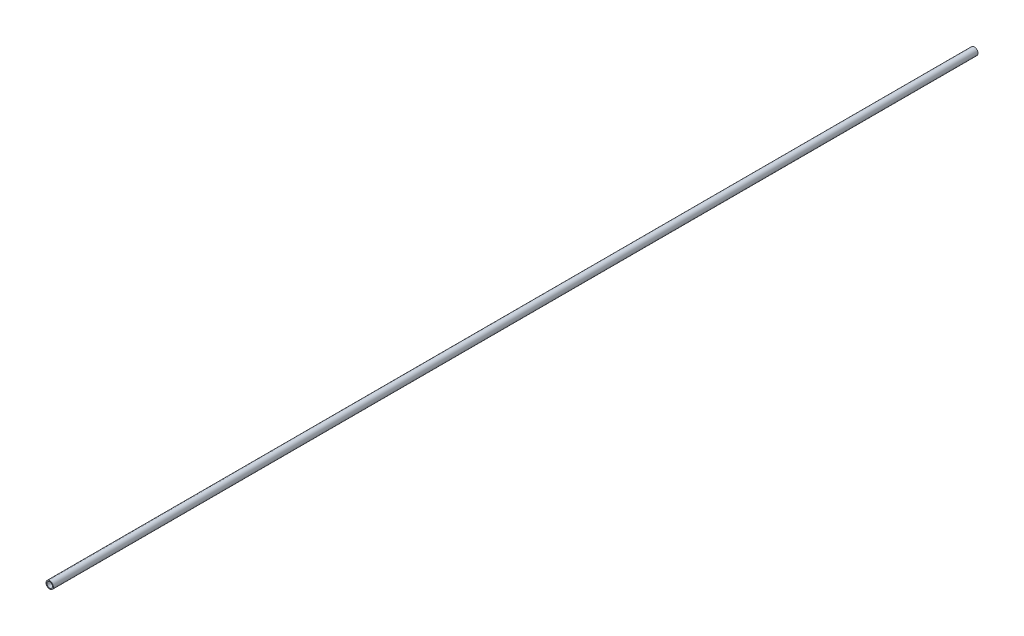
ISO-10303-21;
HEADER;
FILE_DESCRIPTION(('STEP AP214'),'2;1');
FILE_NAME('part.step','',(''),(''),'','','');
FILE_SCHEMA(('AUTOMOTIVE_DESIGN { 1 0 10303 214 1 1 1 1 }'));
ENDSEC;
DATA;
#1=APPLICATION_CONTEXT('core data for automotive mechanical design processes');
#2=APPLICATION_PROTOCOL_DEFINITION('international standard','automotive_design',2000,#1);
#3=PRODUCT_CONTEXT('',#1,'mechanical');
#4=PRODUCT('Part','Part','',(#3));
#5=PRODUCT_RELATED_PRODUCT_CATEGORY('part','',(#4));
#6=PRODUCT_DEFINITION_FORMATION('','',#4);
#7=PRODUCT_DEFINITION_CONTEXT('part definition',#1,'design');
#8=PRODUCT_DEFINITION('design','',#6,#7);
#9=PRODUCT_DEFINITION_SHAPE('','',#8);
#10=(LENGTH_UNIT() NAMED_UNIT(*) SI_UNIT(.MILLI.,.METRE.));
#11=(NAMED_UNIT(*) PLANE_ANGLE_UNIT() SI_UNIT($,.RADIAN.));
#12=(NAMED_UNIT(*) SI_UNIT($,.STERADIAN.) SOLID_ANGLE_UNIT());
#13=UNCERTAINTY_MEASURE_WITH_UNIT(LENGTH_MEASURE(1.E-05),#10,'distance_accuracy_value','');
#14=(GEOMETRIC_REPRESENTATION_CONTEXT(3) GLOBAL_UNCERTAINTY_ASSIGNED_CONTEXT((#13)) GLOBAL_UNIT_ASSIGNED_CONTEXT((#10,
#11,#12)) REPRESENTATION_CONTEXT('',''));
#15=CARTESIAN_POINT('',(0.,0.,0.));
#16=DIRECTION('',(0.,0.,1.));
#17=DIRECTION('',(1.,0.,0.));
#18=AXIS2_PLACEMENT_3D('',#15,#16,#17);
#19=CARTESIAN_POINT('',(0.,0.,1000.));
#20=DIRECTION('',(0.,0.,1.));
#21=DIRECTION('',(1.,0.,0.));
#22=AXIS2_PLACEMENT_3D('',#19,#20,#21);
#23=PLANE('',#22);
#24=CARTESIAN_POINT('',(0.,0.,1000.));
#25=DIRECTION('',(0.,0.,1.));
#26=DIRECTION('',(1.,0.,0.));
#27=AXIS2_PLACEMENT_3D('',#24,#25,#26);
#28=CIRCLE('',#27,4.);
#29=CARTESIAN_POINT('',(4.,0.,1000.));
#30=VERTEX_POINT('',#29);
#31=EDGE_CURVE('E10',#30,#30,#28,.T.);
#32=ORIENTED_EDGE('',*,*,#31,.T.);
#33=EDGE_LOOP('',(#32));
#34=FACE_BOUND('',#33,.T.);
#35=CARTESIAN_POINT('',(0.,0.,1000.));
#36=DIRECTION('',(0.,0.,1.));
#37=DIRECTION('',(1.,0.,0.));
#38=AXIS2_PLACEMENT_3D('',#35,#36,#37);
#39=CIRCLE('',#38,3.);
#40=CARTESIAN_POINT('',(3.,0.,1000.));
#41=VERTEX_POINT('',#40);
#42=EDGE_CURVE('E45',#41,#41,#39,.T.);
#43=ORIENTED_EDGE('',*,*,#42,.F.);
#44=EDGE_LOOP('',(#43));
#45=FACE_BOUND('',#44,.T.);
#46=ADVANCED_FACE('F34',(#34,#45),#23,.T.);
#47=CARTESIAN_POINT('',(0.,0.,0.));
#48=DIRECTION('',(0.,0.,1.));
#49=DIRECTION('',(1.,0.,0.));
#50=AXIS2_PLACEMENT_3D('',#47,#48,#49);
#51=PLANE('',#50);
#52=CARTESIAN_POINT('',(0.,0.,0.));
#53=DIRECTION('',(0.,0.,1.));
#54=DIRECTION('',(1.,0.,0.));
#55=AXIS2_PLACEMENT_3D('',#52,#53,#54);
#56=CIRCLE('',#55,4.);
#57=CARTESIAN_POINT('',(4.,0.,0.));
#58=VERTEX_POINT('',#57);
#59=EDGE_CURVE('E38',#58,#58,#56,.T.);
#60=ORIENTED_EDGE('',*,*,#59,.F.);
#61=EDGE_LOOP('',(#60));
#62=FACE_BOUND('',#61,.T.);
#63=CARTESIAN_POINT('',(0.,0.,0.));
#64=DIRECTION('',(0.,0.,1.));
#65=DIRECTION('',(1.,0.,0.));
#66=AXIS2_PLACEMENT_3D('',#63,#64,#65);
#67=CIRCLE('',#66,3.);
#68=CARTESIAN_POINT('',(3.,0.,0.));
#69=VERTEX_POINT('',#68);
#70=EDGE_CURVE('E47',#69,#69,#67,.T.);
#71=ORIENTED_EDGE('',*,*,#70,.T.);
#72=EDGE_LOOP('',(#71));
#73=FACE_BOUND('',#72,.T.);
#74=ADVANCED_FACE('F57',(#62,#73),#51,.F.);
#75=CARTESIAN_POINT('',(0.,0.,1000.));
#76=DIRECTION('',(0.,0.,-1.));
#77=DIRECTION('',(-1.,0.,0.));
#78=AXIS2_PLACEMENT_3D('',#75,#76,#77);
#79=CYLINDRICAL_SURFACE('',#78,4.);
#80=ORIENTED_EDGE('',*,*,#31,.F.);
#81=EDGE_LOOP('',(#80));
#82=FACE_BOUND('',#81,.T.);
#83=ORIENTED_EDGE('',*,*,#59,.T.);
#84=EDGE_LOOP('',(#83));
#85=FACE_BOUND('',#84,.T.);
#86=ADVANCED_FACE('F36',(#82,#85),#79,.T.);
#87=CARTESIAN_POINT('',(0.,0.,1000.));
#88=DIRECTION('',(0.,0.,-1.));
#89=DIRECTION('',(-1.,0.,0.));
#90=AXIS2_PLACEMENT_3D('',#87,#88,#89);
#91=CYLINDRICAL_SURFACE('',#90,3.);
#92=ORIENTED_EDGE('',*,*,#42,.T.);
#93=EDGE_LOOP('',(#92));
#94=FACE_BOUND('',#93,.T.);
#95=ORIENTED_EDGE('',*,*,#70,.F.);
#96=EDGE_LOOP('',(#95));
#97=FACE_BOUND('',#96,.T.);
#98=ADVANCED_FACE('F53',(#94,#97),#91,.F.);
#99=CLOSED_SHELL('',(#46,#74,#86,#98));
#100=MANIFOLD_SOLID_BREP('B2',#99);
#101=ADVANCED_BREP_SHAPE_REPRESENTATION('',(#18,#100),#14);
#102=SHAPE_DEFINITION_REPRESENTATION(#9,#101);
ENDSEC;
END-ISO-10303-21;
